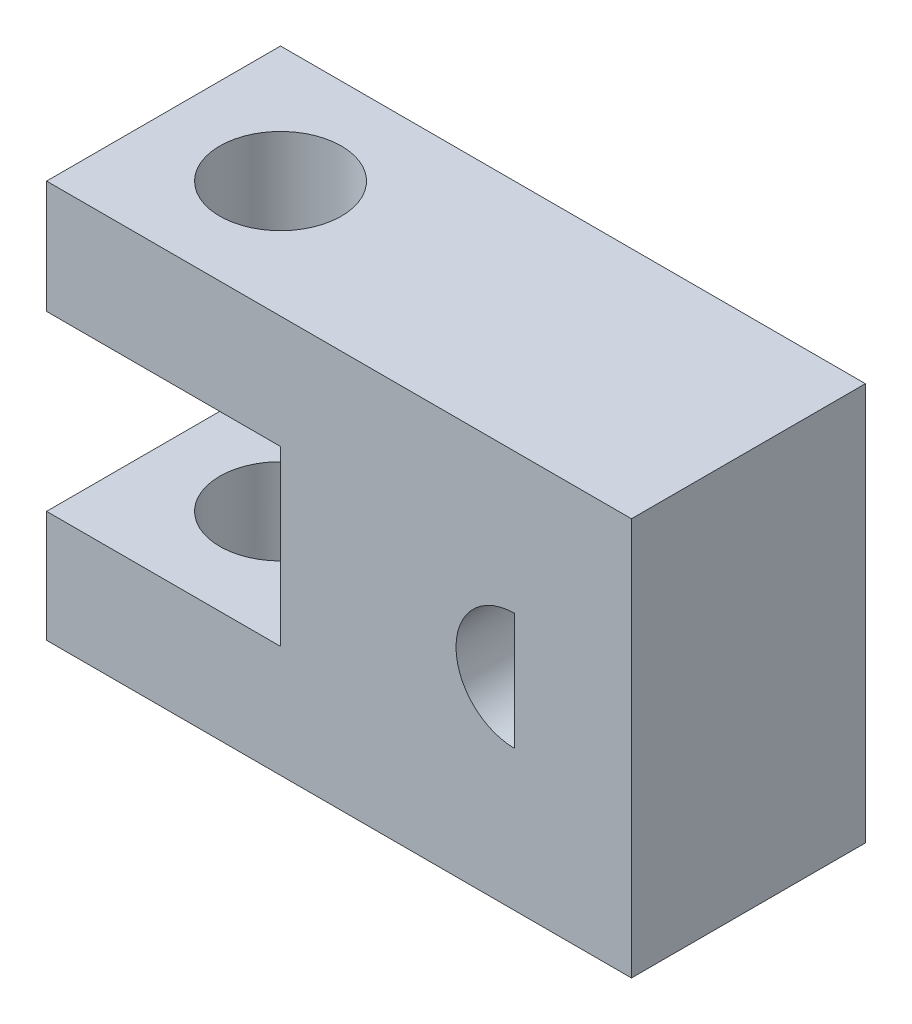
ISO-10303-21;
HEADER;
FILE_DESCRIPTION(('STEP AP214'),'2;1');
FILE_NAME('part.step','',(''),(''),'','','');
FILE_SCHEMA(('AUTOMOTIVE_DESIGN { 1 0 10303 214 1 1 1 1 }'));
ENDSEC;
DATA;
#1=APPLICATION_CONTEXT('core data for automotive mechanical design processes');
#2=APPLICATION_PROTOCOL_DEFINITION('international standard','automotive_design',2000,#1);
#3=PRODUCT_CONTEXT('',#1,'mechanical');
#4=PRODUCT('Part','Part','',(#3));
#5=PRODUCT_RELATED_PRODUCT_CATEGORY('part','',(#4));
#6=PRODUCT_DEFINITION_FORMATION('','',#4);
#7=PRODUCT_DEFINITION_CONTEXT('part definition',#1,'design');
#8=PRODUCT_DEFINITION('design','',#6,#7);
#9=PRODUCT_DEFINITION_SHAPE('','',#8);
#10=(LENGTH_UNIT() NAMED_UNIT(*) SI_UNIT(.MILLI.,.METRE.));
#11=(NAMED_UNIT(*) PLANE_ANGLE_UNIT() SI_UNIT($,.RADIAN.));
#12=(NAMED_UNIT(*) SI_UNIT($,.STERADIAN.) SOLID_ANGLE_UNIT());
#13=UNCERTAINTY_MEASURE_WITH_UNIT(LENGTH_MEASURE(1.E-05),#10,'distance_accuracy_value','');
#14=(GEOMETRIC_REPRESENTATION_CONTEXT(3) GLOBAL_UNCERTAINTY_ASSIGNED_CONTEXT((#13)) GLOBAL_UNIT_ASSIGNED_CONTEXT((#10,
#11,#12)) REPRESENTATION_CONTEXT('',''));
#15=CARTESIAN_POINT('',(0.,0.,0.));
#16=DIRECTION('',(0.,0.,1.));
#17=DIRECTION('',(1.,0.,0.));
#18=AXIS2_PLACEMENT_3D('',#15,#16,#17);
#19=CARTESIAN_POINT('',(0.,0.,12.7));
#20=DIRECTION('',(1.,0.,0.));
#21=DIRECTION('',(0.,0.,-1.));
#22=AXIS2_PLACEMENT_3D('',#19,#20,#21);
#23=PLANE('',#22);
#24=DIRECTION('',(0.,0.,1.));
#25=VECTOR('',#24,1.);
#26=CARTESIAN_POINT('',(0.,15.4621089555178,-0.254000000000001));
#27=LINE('',#26,#25);
#28=CARTESIAN_POINT('',(0.,15.4621089555178,0.));
#29=VERTEX_POINT('',#28);
#30=CARTESIAN_POINT('',(0.,15.4621089555178,12.7));
#31=VERTEX_POINT('',#30);
#32=EDGE_CURVE('E145',#29,#31,#27,.T.);
#33=ORIENTED_EDGE('',*,*,#32,.T.);
#34=DIRECTION('',(0.,-1.,0.));
#35=VECTOR('',#34,1.);
#36=CARTESIAN_POINT('',(0.,0.,12.7));
#37=LINE('',#36,#35);
#38=CARTESIAN_POINT('',(0.,21.59,12.7));
#39=VERTEX_POINT('',#38);
#40=EDGE_CURVE('E149',#39,#31,#37,.T.);
#41=ORIENTED_EDGE('',*,*,#40,.F.);
#42=DIRECTION('',(0.,0.,-1.));
#43=VECTOR('',#42,1.);
#44=CARTESIAN_POINT('',(0.,21.59,12.7));
#45=LINE('',#44,#43);
#46=CARTESIAN_POINT('',(0.,21.59,0.));
#47=VERTEX_POINT('',#46);
#48=EDGE_CURVE('E159',#39,#47,#45,.T.);
#49=ORIENTED_EDGE('',*,*,#48,.T.);
#50=DIRECTION('',(0.,-1.,0.));
#51=VECTOR('',#50,1.);
#52=CARTESIAN_POINT('',(0.,0.,0.));
#53=LINE('',#52,#51);
#54=EDGE_CURVE('E160',#47,#29,#53,.T.);
#55=ORIENTED_EDGE('',*,*,#54,.T.);
#56=EDGE_LOOP('',(#33,#41,#49,#55));
#57=FACE_BOUND('',#56,.T.);
#58=ADVANCED_FACE('F32',(#57),#23,.F.);
#59=DIRECTION('',(0.,0.,1.));
#60=VECTOR('',#59,1.);
#61=CARTESIAN_POINT('',(0.,6.0641089555178,-0.254000000000001));
#62=LINE('',#61,#60);
#63=CARTESIAN_POINT('',(0.,6.0641089555178,0.));
#64=VERTEX_POINT('',#63);
#65=CARTESIAN_POINT('',(0.,6.0641089555178,12.7));
#66=VERTEX_POINT('',#65);
#67=EDGE_CURVE('E139',#64,#66,#62,.T.);
#68=ORIENTED_EDGE('',*,*,#67,.F.);
#69=CARTESIAN_POINT('',(0.,0.,0.));
#70=VERTEX_POINT('',#69);
#71=EDGE_CURVE('E148',#64,#70,#53,.T.);
#72=ORIENTED_EDGE('',*,*,#71,.T.);
#73=DIRECTION('',(0.,0.,-1.));
#74=VECTOR('',#73,1.);
#75=CARTESIAN_POINT('',(0.,0.,12.7));
#76=LINE('',#75,#74);
#77=CARTESIAN_POINT('',(0.,0.,12.7));
#78=VERTEX_POINT('',#77);
#79=EDGE_CURVE('E177',#78,#70,#76,.T.);
#80=ORIENTED_EDGE('',*,*,#79,.F.);
#81=EDGE_CURVE('E153',#66,#78,#37,.T.);
#82=ORIENTED_EDGE('',*,*,#81,.F.);
#83=EDGE_LOOP('',(#68,#72,#80,#82));
#84=FACE_BOUND('',#83,.T.);
#85=ADVANCED_FACE('F226',(#84),#23,.F.);
#86=CARTESIAN_POINT('',(0.,0.,12.7));
#87=DIRECTION('',(0.,0.,-1.));
#88=DIRECTION('',(-1.,0.,0.));
#89=AXIS2_PLACEMENT_3D('',#86,#87,#88);
#90=PLANE('',#89);
#91=DIRECTION('',(0.,1.,0.));
#92=VECTOR('',#91,1.);
#93=CARTESIAN_POINT('',(25.4,13.97,12.7));
#94=LINE('',#93,#92);
#95=CARTESIAN_POINT('',(25.4,7.62,12.7));
#96=VERTEX_POINT('',#95);
#97=CARTESIAN_POINT('',(25.4,13.97,12.7));
#98=VERTEX_POINT('',#97);
#99=EDGE_CURVE('E112',#96,#98,#94,.T.);
#100=ORIENTED_EDGE('',*,*,#99,.F.);
#101=CARTESIAN_POINT('',(25.4,10.795,12.7));
#102=DIRECTION('',(0.,0.,1.));
#103=DIRECTION('',(1.,0.,0.));
#104=AXIS2_PLACEMENT_3D('',#101,#102,#103);
#105=CIRCLE('',#104,3.175);
#106=EDGE_CURVE('E46',#98,#96,#105,.T.);
#107=ORIENTED_EDGE('',*,*,#106,.F.);
#108=EDGE_LOOP('',(#100,#107));
#109=FACE_BOUND('',#108,.T.);
#110=DIRECTION('',(1.,0.,0.));
#111=VECTOR('',#110,1.);
#112=CARTESIAN_POINT('',(0.,15.4621089555178,12.7));
#113=LINE('',#112,#111);
#114=CARTESIAN_POINT('',(12.7,15.4621089555178,12.7));
#115=VERTEX_POINT('',#114);
#116=EDGE_CURVE('E130',#31,#115,#113,.T.);
#117=ORIENTED_EDGE('',*,*,#116,.T.);
#118=DIRECTION('',(0.,-1.,0.));
#119=VECTOR('',#118,1.);
#120=CARTESIAN_POINT('',(12.7,15.4621089555178,12.7));
#121=LINE('',#120,#119);
#122=CARTESIAN_POINT('',(12.7,6.06410895551781,12.7));
#123=VERTEX_POINT('',#122);
#124=EDGE_CURVE('E133',#115,#123,#121,.T.);
#125=ORIENTED_EDGE('',*,*,#124,.T.);
#126=DIRECTION('',(-1.,0.,0.));
#127=VECTOR('',#126,1.);
#128=CARTESIAN_POINT('',(12.7,6.06410895551781,12.7));
#129=LINE('',#128,#127);
#130=EDGE_CURVE('E136',#123,#66,#129,.T.);
#131=ORIENTED_EDGE('',*,*,#130,.T.);
#132=ORIENTED_EDGE('',*,*,#81,.T.);
#133=DIRECTION('',(1.,0.,0.));
#134=VECTOR('',#133,1.);
#135=CARTESIAN_POINT('',(0.,0.,12.7));
#136=LINE('',#135,#134);
#137=CARTESIAN_POINT('',(31.75,0.,12.7));
#138=VERTEX_POINT('',#137);
#139=EDGE_CURVE('E152',#78,#138,#136,.T.);
#140=ORIENTED_EDGE('',*,*,#139,.T.);
#141=DIRECTION('',(0.,1.,0.));
#142=VECTOR('',#141,1.);
#143=CARTESIAN_POINT('',(31.75,0.,12.7));
#144=LINE('',#143,#142);
#145=CARTESIAN_POINT('',(31.75,21.59,12.7));
#146=VERTEX_POINT('',#145);
#147=EDGE_CURVE('E155',#138,#146,#144,.T.);
#148=ORIENTED_EDGE('',*,*,#147,.T.);
#149=DIRECTION('',(-1.,0.,0.));
#150=VECTOR('',#149,1.);
#151=CARTESIAN_POINT('',(0.,21.59,12.7));
#152=LINE('',#151,#150);
#153=EDGE_CURVE('E157',#146,#39,#152,.T.);
#154=ORIENTED_EDGE('',*,*,#153,.T.);
#155=ORIENTED_EDGE('',*,*,#40,.T.);
#156=EDGE_LOOP('',(#117,#125,#131,#132,#140,#148,#154,#155));
#157=FACE_BOUND('',#156,.T.);
#158=ADVANCED_FACE('F116',(#109,#157),#90,.F.);
#159=CARTESIAN_POINT('',(0.,0.,0.));
#160=DIRECTION('',(0.,0.,-1.));
#161=DIRECTION('',(-1.,0.,0.));
#162=AXIS2_PLACEMENT_3D('',#159,#160,#161);
#163=PLANE('',#162);
#164=CARTESIAN_POINT('',(25.4,10.795,0.));
#165=DIRECTION('',(0.,0.,-1.));
#166=DIRECTION('',(-1.,0.,0.));
#167=AXIS2_PLACEMENT_3D('',#164,#165,#166);
#168=CIRCLE('',#167,3.175);
#169=CARTESIAN_POINT('',(25.4,7.62,0.));
#170=VERTEX_POINT('',#169);
#171=CARTESIAN_POINT('',(25.4,13.97,0.));
#172=VERTEX_POINT('',#171);
#173=EDGE_CURVE('E11',#170,#172,#168,.T.);
#174=ORIENTED_EDGE('',*,*,#173,.F.);
#175=DIRECTION('',(0.,-1.,0.));
#176=VECTOR('',#175,1.);
#177=CARTESIAN_POINT('',(25.4,0.,0.));
#178=LINE('',#177,#176);
#179=EDGE_CURVE('E39',#172,#170,#178,.T.);
#180=ORIENTED_EDGE('',*,*,#179,.F.);
#181=EDGE_LOOP('',(#174,#180));
#182=FACE_BOUND('',#181,.T.);
#183=DIRECTION('',(0.,1.,0.));
#184=VECTOR('',#183,1.);
#185=CARTESIAN_POINT('',(12.7,0.,0.));
#186=LINE('',#185,#184);
#187=CARTESIAN_POINT('',(12.7,6.06410895551781,0.));
#188=VERTEX_POINT('',#187);
#189=CARTESIAN_POINT('',(12.7,15.4621089555178,0.));
#190=VERTEX_POINT('',#189);
#191=EDGE_CURVE('E183',#188,#190,#186,.T.);
#192=ORIENTED_EDGE('',*,*,#191,.T.);
#193=DIRECTION('',(-1.,0.,0.));
#194=VECTOR('',#193,1.);
#195=CARTESIAN_POINT('',(0.,15.4621089555178,0.));
#196=LINE('',#195,#194);
#197=EDGE_CURVE('E186',#190,#29,#196,.T.);
#198=ORIENTED_EDGE('',*,*,#197,.T.);
#199=ORIENTED_EDGE('',*,*,#54,.F.);
#200=DIRECTION('',(-1.,0.,0.));
#201=VECTOR('',#200,1.);
#202=CARTESIAN_POINT('',(0.,21.59,0.));
#203=LINE('',#202,#201);
#204=CARTESIAN_POINT('',(31.75,21.59,0.));
#205=VERTEX_POINT('',#204);
#206=EDGE_CURVE('E167',#205,#47,#203,.T.);
#207=ORIENTED_EDGE('',*,*,#206,.F.);
#208=DIRECTION('',(0.,1.,0.));
#209=VECTOR('',#208,1.);
#210=CARTESIAN_POINT('',(31.75,0.,0.));
#211=LINE('',#210,#209);
#212=CARTESIAN_POINT('',(31.75,0.,0.));
#213=VERTEX_POINT('',#212);
#214=EDGE_CURVE('E165',#213,#205,#211,.T.);
#215=ORIENTED_EDGE('',*,*,#214,.F.);
#216=DIRECTION('',(1.,0.,0.));
#217=VECTOR('',#216,1.);
#218=CARTESIAN_POINT('',(0.,0.,0.));
#219=LINE('',#218,#217);
#220=EDGE_CURVE('E163',#70,#213,#219,.T.);
#221=ORIENTED_EDGE('',*,*,#220,.F.);
#222=ORIENTED_EDGE('',*,*,#71,.F.);
#223=DIRECTION('',(1.,0.,0.));
#224=VECTOR('',#223,1.);
#225=CARTESIAN_POINT('',(0.,6.0641089555178,0.));
#226=LINE('',#225,#224);
#227=EDGE_CURVE('E180',#64,#188,#226,.T.);
#228=ORIENTED_EDGE('',*,*,#227,.T.);
#229=EDGE_LOOP('',(#192,#198,#199,#207,#215,#221,#222,#228));
#230=FACE_BOUND('',#229,.T.);
#231=ADVANCED_FACE('F191',(#182,#230),#163,.T.);
#232=CARTESIAN_POINT('',(0.,0.,12.7));
#233=DIRECTION('',(0.,1.,0.));
#234=DIRECTION('',(0.,0.,1.));
#235=AXIS2_PLACEMENT_3D('',#232,#233,#234);
#236=PLANE('',#235);
#237=CARTESIAN_POINT('',(6.35,0.,6.35));
#238=DIRECTION('',(0.,-1.,0.));
#239=DIRECTION('',(0.,0.,-1.));
#240=AXIS2_PLACEMENT_3D('',#237,#238,#239);
#241=CIRCLE('',#240,3.302);
#242=CARTESIAN_POINT('',(6.35,0.,3.048));
#243=VERTEX_POINT('',#242);
#244=EDGE_CURVE('E108',#243,#243,#241,.T.);
#245=ORIENTED_EDGE('',*,*,#244,.F.);
#246=EDGE_LOOP('',(#245));
#247=FACE_BOUND('',#246,.T.);
#248=ORIENTED_EDGE('',*,*,#220,.T.);
#249=DIRECTION('',(0.,0.,-1.));
#250=VECTOR('',#249,1.);
#251=CARTESIAN_POINT('',(31.75,0.,12.7));
#252=LINE('',#251,#250);
#253=EDGE_CURVE('E174',#138,#213,#252,.T.);
#254=ORIENTED_EDGE('',*,*,#253,.F.);
#255=ORIENTED_EDGE('',*,*,#139,.F.);
#256=ORIENTED_EDGE('',*,*,#79,.T.);
#257=EDGE_LOOP('',(#248,#254,#255,#256));
#258=FACE_BOUND('',#257,.T.);
#259=ADVANCED_FACE('F194',(#247,#258),#236,.F.);
#260=CARTESIAN_POINT('',(31.75,0.,12.7));
#261=DIRECTION('',(-1.,0.,0.));
#262=DIRECTION('',(0.,0.,1.));
#263=AXIS2_PLACEMENT_3D('',#260,#261,#262);
#264=PLANE('',#263);
#265=ORIENTED_EDGE('',*,*,#214,.T.);
#266=DIRECTION('',(0.,0.,-1.));
#267=VECTOR('',#266,1.);
#268=CARTESIAN_POINT('',(31.75,21.59,12.7));
#269=LINE('',#268,#267);
#270=EDGE_CURVE('E171',#146,#205,#269,.T.);
#271=ORIENTED_EDGE('',*,*,#270,.F.);
#272=ORIENTED_EDGE('',*,*,#147,.F.);
#273=ORIENTED_EDGE('',*,*,#253,.T.);
#274=EDGE_LOOP('',(#265,#271,#272,#273));
#275=FACE_BOUND('',#274,.T.);
#276=ADVANCED_FACE('F218',(#275),#264,.F.);
#277=CARTESIAN_POINT('',(0.,21.59,12.7));
#278=DIRECTION('',(0.,-1.,0.));
#279=DIRECTION('',(0.,0.,-1.));
#280=AXIS2_PLACEMENT_3D('',#277,#278,#279);
#281=PLANE('',#280);
#282=CARTESIAN_POINT('',(6.35,21.59,6.35));
#283=DIRECTION('',(0.,-1.,0.));
#284=DIRECTION('',(0.,0.,-1.));
#285=AXIS2_PLACEMENT_3D('',#282,#283,#284);
#286=CIRCLE('',#285,3.302);
#287=CARTESIAN_POINT('',(6.35,21.59,3.048));
#288=VERTEX_POINT('',#287);
#289=EDGE_CURVE('E127',#288,#288,#286,.T.);
#290=ORIENTED_EDGE('',*,*,#289,.T.);
#291=EDGE_LOOP('',(#290));
#292=FACE_BOUND('',#291,.T.);
#293=ORIENTED_EDGE('',*,*,#206,.T.);
#294=ORIENTED_EDGE('',*,*,#48,.F.);
#295=ORIENTED_EDGE('',*,*,#153,.F.);
#296=ORIENTED_EDGE('',*,*,#270,.T.);
#297=EDGE_LOOP('',(#293,#294,#295,#296));
#298=FACE_BOUND('',#297,.T.);
#299=ADVANCED_FACE('F213',(#292,#298),#281,.F.);
#300=CARTESIAN_POINT('',(0.,15.4621089555178,-0.254000000000001));
#301=DIRECTION('',(0.,-1.,0.));
#302=DIRECTION('',(0.,0.,-1.));
#303=AXIS2_PLACEMENT_3D('',#300,#301,#302);
#304=PLANE('',#303);
#305=CARTESIAN_POINT('',(6.35,15.4621089555178,6.35));
#306=DIRECTION('',(0.,-1.,0.));
#307=DIRECTION('',(0.,0.,-1.));
#308=AXIS2_PLACEMENT_3D('',#305,#306,#307);
#309=CIRCLE('',#308,3.302);
#310=CARTESIAN_POINT('',(6.35,15.4621089555178,3.048));
#311=VERTEX_POINT('',#310);
#312=EDGE_CURVE('E124',#311,#311,#309,.T.);
#313=ORIENTED_EDGE('',*,*,#312,.F.);
#314=EDGE_LOOP('',(#313));
#315=FACE_BOUND('',#314,.T.);
#316=DIRECTION('',(0.,0.,1.));
#317=VECTOR('',#316,1.);
#318=CARTESIAN_POINT('',(12.7,15.4621089555178,-0.254000000000001));
#319=LINE('',#318,#317);
#320=EDGE_CURVE('E143',#190,#115,#319,.T.);
#321=ORIENTED_EDGE('',*,*,#320,.T.);
#322=ORIENTED_EDGE('',*,*,#116,.F.);
#323=ORIENTED_EDGE('',*,*,#32,.F.);
#324=ORIENTED_EDGE('',*,*,#197,.F.);
#325=EDGE_LOOP('',(#321,#322,#323,#324));
#326=FACE_BOUND('',#325,.T.);
#327=ADVANCED_FACE('F205',(#315,#326),#304,.T.);
#328=CARTESIAN_POINT('',(12.7,15.4621089555178,-0.254000000000001));
#329=DIRECTION('',(-1.,0.,0.));
#330=DIRECTION('',(0.,-1.,0.));
#331=AXIS2_PLACEMENT_3D('',#328,#329,#330);
#332=PLANE('',#331);
#333=DIRECTION('',(0.,0.,1.));
#334=VECTOR('',#333,1.);
#335=CARTESIAN_POINT('',(12.7,6.06410895551781,-0.254000000000001));
#336=LINE('',#335,#334);
#337=EDGE_CURVE('E141',#188,#123,#336,.T.);
#338=ORIENTED_EDGE('',*,*,#337,.T.);
#339=ORIENTED_EDGE('',*,*,#124,.F.);
#340=ORIENTED_EDGE('',*,*,#320,.F.);
#341=ORIENTED_EDGE('',*,*,#191,.F.);
#342=EDGE_LOOP('',(#338,#339,#340,#341));
#343=FACE_BOUND('',#342,.T.);
#344=ADVANCED_FACE('F201',(#343),#332,.T.);
#345=CARTESIAN_POINT('',(12.7,6.06410895551781,-0.254000000000001));
#346=DIRECTION('',(0.,1.,0.));
#347=DIRECTION('',(-1.,0.,0.));
#348=AXIS2_PLACEMENT_3D('',#345,#346,#347);
#349=PLANE('',#348);
#350=CARTESIAN_POINT('',(6.35,6.06410895551781,6.35));
#351=DIRECTION('',(0.,1.,0.));
#352=DIRECTION('',(-1.,0.,0.));
#353=AXIS2_PLACEMENT_3D('',#350,#351,#352);
#354=CIRCLE('',#353,3.302);
#355=CARTESIAN_POINT('',(3.048,6.06410895551781,6.35));
#356=VERTEX_POINT('',#355);
#357=EDGE_CURVE('E123',#356,#356,#354,.T.);
#358=ORIENTED_EDGE('',*,*,#357,.F.);
#359=EDGE_LOOP('',(#358));
#360=FACE_BOUND('',#359,.T.);
#361=ORIENTED_EDGE('',*,*,#67,.T.);
#362=ORIENTED_EDGE('',*,*,#130,.F.);
#363=ORIENTED_EDGE('',*,*,#337,.F.);
#364=ORIENTED_EDGE('',*,*,#227,.F.);
#365=EDGE_LOOP('',(#361,#362,#363,#364));
#366=FACE_BOUND('',#365,.T.);
#367=ADVANCED_FACE('F228',(#360,#366),#349,.T.);
#368=CARTESIAN_POINT('',(6.35,25.4,6.35));
#369=DIRECTION('',(0.,-1.,0.));
#370=DIRECTION('',(0.,0.,-1.));
#371=AXIS2_PLACEMENT_3D('',#368,#369,#370);
#372=CYLINDRICAL_SURFACE('',#371,3.302);
#373=ORIENTED_EDGE('',*,*,#357,.T.);
#374=EDGE_LOOP('',(#373));
#375=FACE_BOUND('',#374,.T.);
#376=ORIENTED_EDGE('',*,*,#244,.T.);
#377=EDGE_LOOP('',(#376));
#378=FACE_BOUND('',#377,.T.);
#379=ADVANCED_FACE('F230',(#375,#378),#372,.F.);
#380=ORIENTED_EDGE('',*,*,#312,.T.);
#381=EDGE_LOOP('',(#380));
#382=FACE_BOUND('',#381,.T.);
#383=ORIENTED_EDGE('',*,*,#289,.F.);
#384=EDGE_LOOP('',(#383));
#385=FACE_BOUND('',#384,.T.);
#386=ADVANCED_FACE('F237',(#382,#385),#372,.F.);
#387=CARTESIAN_POINT('',(25.4,10.795,-19.05));
#388=DIRECTION('',(0.,0.,1.));
#389=DIRECTION('',(1.,0.,0.));
#390=AXIS2_PLACEMENT_3D('',#387,#388,#389);
#391=CYLINDRICAL_SURFACE('',#390,3.175);
#392=ORIENTED_EDGE('',*,*,#173,.T.);
#393=DIRECTION('',(0.,0.,1.));
#394=VECTOR('',#393,1.);
#395=CARTESIAN_POINT('',(25.4,13.97,-19.05));
#396=LINE('',#395,#394);
#397=EDGE_CURVE('E53',#172,#98,#396,.T.);
#398=ORIENTED_EDGE('',*,*,#397,.T.);
#399=ORIENTED_EDGE('',*,*,#106,.T.);
#400=DIRECTION('',(0.,0.,1.));
#401=VECTOR('',#400,1.);
#402=CARTESIAN_POINT('',(25.4,7.62,-19.05));
#403=LINE('',#402,#401);
#404=EDGE_CURVE('E109',#170,#96,#403,.T.);
#405=ORIENTED_EDGE('',*,*,#404,.F.);
#406=EDGE_LOOP('',(#392,#398,#399,#405));
#407=FACE_BOUND('',#406,.T.);
#408=ADVANCED_FACE('F105',(#407),#391,.F.);
#409=CARTESIAN_POINT('',(25.4,13.97,-19.05));
#410=DIRECTION('',(1.,0.,0.));
#411=DIRECTION('',(0.,1.,0.));
#412=AXIS2_PLACEMENT_3D('',#409,#410,#411);
#413=PLANE('',#412);
#414=ORIENTED_EDGE('',*,*,#179,.T.);
#415=ORIENTED_EDGE('',*,*,#404,.T.);
#416=ORIENTED_EDGE('',*,*,#99,.T.);
#417=ORIENTED_EDGE('',*,*,#397,.F.);
#418=EDGE_LOOP('',(#414,#415,#416,#417));
#419=FACE_BOUND('',#418,.T.);
#420=ADVANCED_FACE('F113',(#419),#413,.F.);
#421=CLOSED_SHELL('',(#58,#85,#158,#231,#259,#276,#299,#327,#344,#367,#379,#386,#408,#420));
#422=MANIFOLD_SOLID_BREP('B2',#421);
#423=ADVANCED_BREP_SHAPE_REPRESENTATION('',(#18,#422),#14);
#424=SHAPE_DEFINITION_REPRESENTATION(#9,#423);
ENDSEC;
END-ISO-10303-21;
